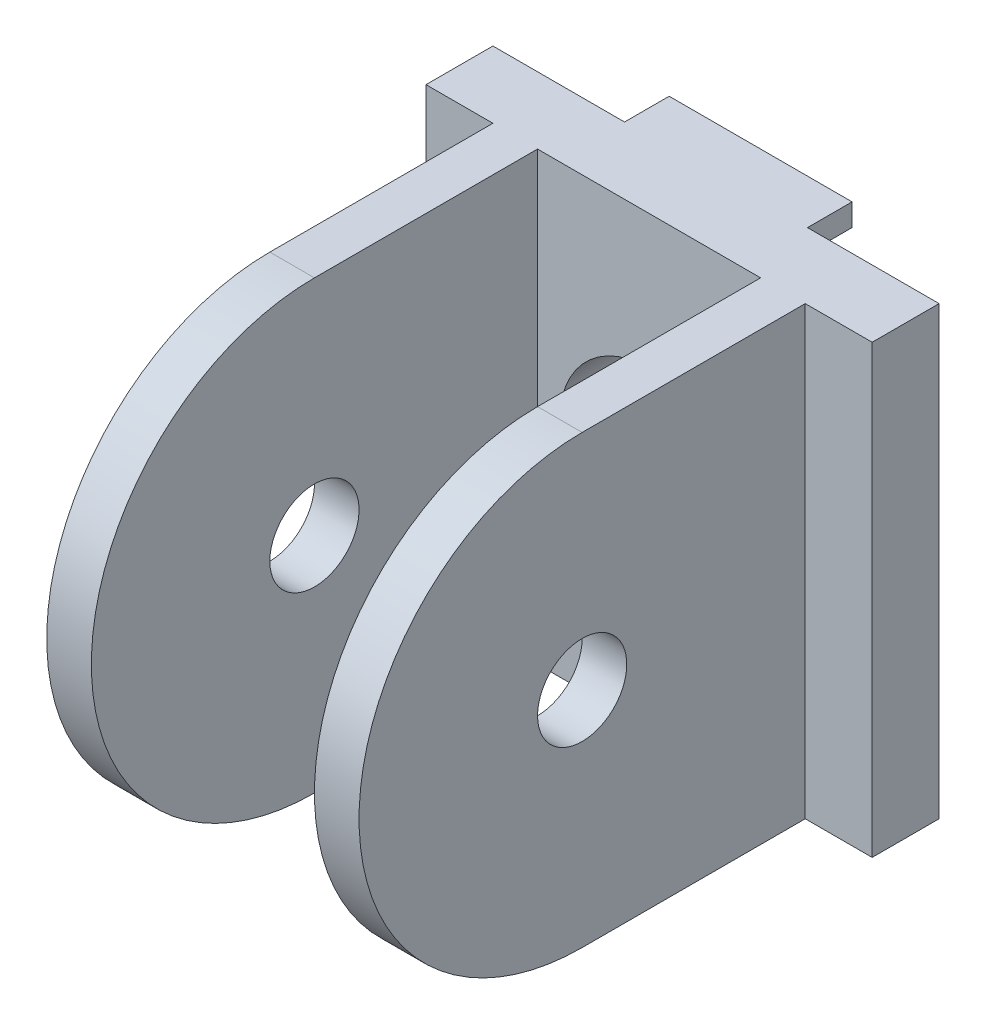
ISO-10303-21;
HEADER;
FILE_DESCRIPTION(('STEP AP214'),'2;1');
FILE_NAME('part.step','',(''),(''),'','','');
FILE_SCHEMA(('AUTOMOTIVE_DESIGN { 1 0 10303 214 1 1 1 1 }'));
ENDSEC;
DATA;
#1=APPLICATION_CONTEXT('core data for automotive mechanical design processes');
#2=APPLICATION_PROTOCOL_DEFINITION('international standard','automotive_design',2000,#1);
#3=PRODUCT_CONTEXT('',#1,'mechanical');
#4=PRODUCT('Part','Part','',(#3));
#5=PRODUCT_RELATED_PRODUCT_CATEGORY('part','',(#4));
#6=PRODUCT_DEFINITION_FORMATION('','',#4);
#7=PRODUCT_DEFINITION_CONTEXT('part definition',#1,'design');
#8=PRODUCT_DEFINITION('design','',#6,#7);
#9=PRODUCT_DEFINITION_SHAPE('','',#8);
#10=(LENGTH_UNIT() NAMED_UNIT(*) SI_UNIT(.MILLI.,.METRE.));
#11=(NAMED_UNIT(*) PLANE_ANGLE_UNIT() SI_UNIT($,.RADIAN.));
#12=(NAMED_UNIT(*) SI_UNIT($,.STERADIAN.) SOLID_ANGLE_UNIT());
#13=UNCERTAINTY_MEASURE_WITH_UNIT(LENGTH_MEASURE(1.E-05),#10,'distance_accuracy_value','');
#14=(GEOMETRIC_REPRESENTATION_CONTEXT(3) GLOBAL_UNCERTAINTY_ASSIGNED_CONTEXT((#13)) GLOBAL_UNIT_ASSIGNED_CONTEXT((#10,
#11,#12)) REPRESENTATION_CONTEXT('',''));
#15=CARTESIAN_POINT('',(0.,0.,0.));
#16=DIRECTION('',(0.,0.,1.));
#17=DIRECTION('',(1.,0.,0.));
#18=AXIS2_PLACEMENT_3D('',#15,#16,#17);
#19=CARTESIAN_POINT('',(10.,10.,0.));
#20=DIRECTION('',(0.,0.,-1.));
#21=DIRECTION('',(-1.,0.,0.));
#22=AXIS2_PLACEMENT_3D('',#19,#20,#21);
#23=PLANE('',#22);
#24=CARTESIAN_POINT('',(0.,0.,0.));
#25=DIRECTION('',(0.,0.,1.));
#26=DIRECTION('',(1.,0.,0.));
#27=AXIS2_PLACEMENT_3D('',#24,#25,#26);
#28=CIRCLE('',#27,4.);
#29=CARTESIAN_POINT('',(4.,0.,0.));
#30=VERTEX_POINT('',#29);
#31=EDGE_CURVE('E315',#30,#30,#28,.T.);
#32=ORIENTED_EDGE('',*,*,#31,.T.);
#33=EDGE_LOOP('',(#32));
#34=FACE_BOUND('',#33,.T.);
#35=DIRECTION('',(1.,0.,0.));
#36=VECTOR('',#35,1.);
#37=CARTESIAN_POINT('',(4.1,-9.,0.));
#38=LINE('',#37,#36);
#39=CARTESIAN_POINT('',(-4.1,-9.,0.));
#40=VERTEX_POINT('',#39);
#41=CARTESIAN_POINT('',(4.1,-9.,0.));
#42=VERTEX_POINT('',#41);
#43=EDGE_CURVE('E428',#40,#42,#38,.T.);
#44=ORIENTED_EDGE('',*,*,#43,.F.);
#45=DIRECTION('',(0.,1.,0.));
#46=VECTOR('',#45,1.);
#47=CARTESIAN_POINT('',(-4.1,-10.,0.));
#48=LINE('',#47,#46);
#49=CARTESIAN_POINT('',(-4.1,-10.,0.));
#50=VERTEX_POINT('',#49);
#51=EDGE_CURVE('E426',#50,#40,#48,.T.);
#52=ORIENTED_EDGE('',*,*,#51,.F.);
#53=DIRECTION('',(1.,0.,0.));
#54=VECTOR('',#53,1.);
#55=CARTESIAN_POINT('',(-10.,-10.,0.));
#56=LINE('',#55,#54);
#57=CARTESIAN_POINT('',(-10.,-10.,0.));
#58=VERTEX_POINT('',#57);
#59=EDGE_CURVE('E198',#58,#50,#56,.T.);
#60=ORIENTED_EDGE('',*,*,#59,.F.);
#61=DIRECTION('',(0.,-1.,0.));
#62=VECTOR('',#61,1.);
#63=CARTESIAN_POINT('',(-10.,-10.,0.));
#64=LINE('',#63,#62);
#65=CARTESIAN_POINT('',(-10.,10.,0.));
#66=VERTEX_POINT('',#65);
#67=EDGE_CURVE('E251',#66,#58,#64,.T.);
#68=ORIENTED_EDGE('',*,*,#67,.F.);
#69=DIRECTION('',(-1.,0.,0.));
#70=VECTOR('',#69,1.);
#71=CARTESIAN_POINT('',(-10.,10.,0.));
#72=LINE('',#71,#70);
#73=CARTESIAN_POINT('',(-4.1,10.,0.));
#74=VERTEX_POINT('',#73);
#75=EDGE_CURVE('E241',#74,#66,#72,.T.);
#76=ORIENTED_EDGE('',*,*,#75,.F.);
#77=DIRECTION('',(0.,1.,0.));
#78=VECTOR('',#77,1.);
#79=CARTESIAN_POINT('',(-4.1,10.,0.));
#80=LINE('',#79,#78);
#81=CARTESIAN_POINT('',(-4.1,9.,0.));
#82=VERTEX_POINT('',#81);
#83=EDGE_CURVE('E210',#82,#74,#80,.T.);
#84=ORIENTED_EDGE('',*,*,#83,.F.);
#85=DIRECTION('',(-1.,0.,0.));
#86=VECTOR('',#85,1.);
#87=CARTESIAN_POINT('',(4.1,9.,0.));
#88=LINE('',#87,#86);
#89=CARTESIAN_POINT('',(4.1,9.,0.));
#90=VERTEX_POINT('',#89);
#91=EDGE_CURVE('E58',#90,#82,#88,.T.);
#92=ORIENTED_EDGE('',*,*,#91,.F.);
#93=DIRECTION('',(0.,-1.,0.));
#94=VECTOR('',#93,1.);
#95=CARTESIAN_POINT('',(4.1,10.,0.));
#96=LINE('',#95,#94);
#97=CARTESIAN_POINT('',(4.1,10.,0.));
#98=VERTEX_POINT('',#97);
#99=EDGE_CURVE('E199',#98,#90,#96,.T.);
#100=ORIENTED_EDGE('',*,*,#99,.F.);
#101=CARTESIAN_POINT('',(10.,10.,0.));
#102=VERTEX_POINT('',#101);
#103=EDGE_CURVE('E244',#102,#98,#72,.T.);
#104=ORIENTED_EDGE('',*,*,#103,.F.);
#105=DIRECTION('',(0.,1.,0.));
#106=VECTOR('',#105,1.);
#107=CARTESIAN_POINT('',(10.,-10.,0.));
#108=LINE('',#107,#106);
#109=CARTESIAN_POINT('',(10.,-10.,0.));
#110=VERTEX_POINT('',#109);
#111=EDGE_CURVE('E245',#110,#102,#108,.T.);
#112=ORIENTED_EDGE('',*,*,#111,.F.);
#113=CARTESIAN_POINT('',(4.1,-10.,0.));
#114=VERTEX_POINT('',#113);
#115=EDGE_CURVE('E254',#114,#110,#56,.T.);
#116=ORIENTED_EDGE('',*,*,#115,.F.);
#117=DIRECTION('',(0.,-1.,0.));
#118=VECTOR('',#117,1.);
#119=CARTESIAN_POINT('',(4.1,-10.,0.));
#120=LINE('',#119,#118);
#121=EDGE_CURVE('E191',#42,#114,#120,.T.);
#122=ORIENTED_EDGE('',*,*,#121,.F.);
#123=EDGE_LOOP('',(#44,#52,#60,#68,#76,#84,#92,#100,#104,#112,#116,#122));
#124=FACE_BOUND('',#123,.T.);
#125=ADVANCED_FACE('F33',(#34,#124),#23,.T.);
#126=CARTESIAN_POINT('',(-10.,10.,3.));
#127=DIRECTION('',(0.,-1.,0.));
#128=DIRECTION('',(0.,0.,-1.));
#129=AXIS2_PLACEMENT_3D('',#126,#127,#128);
#130=PLANE('',#129);
#131=DIRECTION('',(1.,0.,0.));
#132=VECTOR('',#131,1.);
#133=CARTESIAN_POINT('',(-70.0694207708698,10.,13.));
#134=LINE('',#133,#132);
#135=CARTESIAN_POINT('',(5.,10.,13.));
#136=VERTEX_POINT('',#135);
#137=CARTESIAN_POINT('',(7.00000000000001,10.,13.));
#138=VERTEX_POINT('',#137);
#139=EDGE_CURVE('E327',#136,#138,#134,.T.);
#140=ORIENTED_EDGE('',*,*,#139,.T.);
#141=DIRECTION('',(0.,0.,-1.));
#142=VECTOR('',#141,1.);
#143=CARTESIAN_POINT('',(7.,10.,23.));
#144=LINE('',#143,#142);
#145=CARTESIAN_POINT('',(7.,10.,3.));
#146=VERTEX_POINT('',#145);
#147=EDGE_CURVE('E354',#138,#146,#144,.T.);
#148=ORIENTED_EDGE('',*,*,#147,.T.);
#149=DIRECTION('',(-1.,0.,0.));
#150=VECTOR('',#149,1.);
#151=CARTESIAN_POINT('',(-10.,10.,3.));
#152=LINE('',#151,#150);
#153=CARTESIAN_POINT('',(10.,10.,3.));
#154=VERTEX_POINT('',#153);
#155=EDGE_CURVE('E265',#154,#146,#152,.T.);
#156=ORIENTED_EDGE('',*,*,#155,.F.);
#157=DIRECTION('',(0.,0.,-1.));
#158=VECTOR('',#157,1.);
#159=CARTESIAN_POINT('',(10.,10.,3.));
#160=LINE('',#159,#158);
#161=EDGE_CURVE('E11',#154,#102,#160,.T.);
#162=ORIENTED_EDGE('',*,*,#161,.T.);
#163=ORIENTED_EDGE('',*,*,#103,.T.);
#164=DIRECTION('',(0.,0.,1.));
#165=VECTOR('',#164,1.);
#166=CARTESIAN_POINT('',(4.1,10.,-2.));
#167=LINE('',#166,#165);
#168=CARTESIAN_POINT('',(4.1,10.,-2.));
#169=VERTEX_POINT('',#168);
#170=EDGE_CURVE('E216',#169,#98,#167,.T.);
#171=ORIENTED_EDGE('',*,*,#170,.F.);
#172=DIRECTION('',(1.,0.,0.));
#173=VECTOR('',#172,1.);
#174=CARTESIAN_POINT('',(4.1,10.,-2.));
#175=LINE('',#174,#173);
#176=CARTESIAN_POINT('',(-4.1,10.,-2.));
#177=VERTEX_POINT('',#176);
#178=EDGE_CURVE('E214',#177,#169,#175,.T.);
#179=ORIENTED_EDGE('',*,*,#178,.F.);
#180=DIRECTION('',(0.,0.,1.));
#181=VECTOR('',#180,1.);
#182=CARTESIAN_POINT('',(-4.1,10.,-2.));
#183=LINE('',#182,#181);
#184=EDGE_CURVE('E227',#177,#74,#183,.T.);
#185=ORIENTED_EDGE('',*,*,#184,.T.);
#186=ORIENTED_EDGE('',*,*,#75,.T.);
#187=DIRECTION('',(0.,0.,-1.));
#188=VECTOR('',#187,1.);
#189=CARTESIAN_POINT('',(-10.,10.,3.));
#190=LINE('',#189,#188);
#191=CARTESIAN_POINT('',(-10.,10.,3.));
#192=VERTEX_POINT('',#191);
#193=EDGE_CURVE('E42',#192,#66,#190,.T.);
#194=ORIENTED_EDGE('',*,*,#193,.F.);
#195=CARTESIAN_POINT('',(-7.,10.,3.));
#196=VERTEX_POINT('',#195);
#197=EDGE_CURVE('E271',#196,#192,#152,.T.);
#198=ORIENTED_EDGE('',*,*,#197,.F.);
#199=DIRECTION('',(0.,0.,-1.));
#200=VECTOR('',#199,1.);
#201=CARTESIAN_POINT('',(-7.,10.,23.));
#202=LINE('',#201,#200);
#203=CARTESIAN_POINT('',(-7.00000000000001,10.,13.));
#204=VERTEX_POINT('',#203);
#205=EDGE_CURVE('E288',#204,#196,#202,.T.);
#206=ORIENTED_EDGE('',*,*,#205,.F.);
#207=CARTESIAN_POINT('',(-5.,10.,13.));
#208=VERTEX_POINT('',#207);
#209=EDGE_CURVE('E330',#204,#208,#134,.T.);
#210=ORIENTED_EDGE('',*,*,#209,.T.);
#211=DIRECTION('',(0.,0.,-1.));
#212=VECTOR('',#211,1.);
#213=CARTESIAN_POINT('',(-5.,10.,23.));
#214=LINE('',#213,#212);
#215=CARTESIAN_POINT('',(-5.,10.,3.));
#216=VERTEX_POINT('',#215);
#217=EDGE_CURVE('E302',#208,#216,#214,.T.);
#218=ORIENTED_EDGE('',*,*,#217,.T.);
#219=CARTESIAN_POINT('',(5.,10.,3.));
#220=VERTEX_POINT('',#219);
#221=EDGE_CURVE('E270',#220,#216,#152,.T.);
#222=ORIENTED_EDGE('',*,*,#221,.F.);
#223=DIRECTION('',(0.,0.,-1.));
#224=VECTOR('',#223,1.);
#225=CARTESIAN_POINT('',(5.,10.,23.));
#226=LINE('',#225,#224);
#227=EDGE_CURVE('E352',#136,#220,#226,.T.);
#228=ORIENTED_EDGE('',*,*,#227,.F.);
#229=EDGE_LOOP('',(#140,#148,#156,#162,#163,#171,#179,#185,#186,#194,#198,#206,#210,#218,#222,#228));
#230=FACE_BOUND('',#229,.T.);
#231=ADVANCED_FACE('F374',(#230),#130,.F.);
#232=CARTESIAN_POINT('',(10.,10.,3.));
#233=DIRECTION('',(0.,0.,-1.));
#234=DIRECTION('',(-1.,0.,0.));
#235=AXIS2_PLACEMENT_3D('',#232,#233,#234);
#236=PLANE('',#235);
#237=DIRECTION('',(0.,1.,0.));
#238=VECTOR('',#237,1.);
#239=CARTESIAN_POINT('',(7.,-10.,3.));
#240=LINE('',#239,#238);
#241=CARTESIAN_POINT('',(7.,-10.,3.));
#242=VERTEX_POINT('',#241);
#243=EDGE_CURVE('E341',#242,#146,#240,.T.);
#244=ORIENTED_EDGE('',*,*,#243,.F.);
#245=DIRECTION('',(1.,0.,0.));
#246=VECTOR('',#245,1.);
#247=CARTESIAN_POINT('',(-10.,-10.,3.));
#248=LINE('',#247,#246);
#249=CARTESIAN_POINT('',(10.,-10.,3.));
#250=VERTEX_POINT('',#249);
#251=EDGE_CURVE('E283',#242,#250,#248,.T.);
#252=ORIENTED_EDGE('',*,*,#251,.T.);
#253=DIRECTION('',(0.,1.,0.));
#254=VECTOR('',#253,1.);
#255=CARTESIAN_POINT('',(10.,-10.,3.));
#256=LINE('',#255,#254);
#257=EDGE_CURVE('E256',#250,#154,#256,.T.);
#258=ORIENTED_EDGE('',*,*,#257,.T.);
#259=ORIENTED_EDGE('',*,*,#155,.T.);
#260=EDGE_LOOP('',(#244,#252,#258,#259));
#261=FACE_BOUND('',#260,.T.);
#262=ADVANCED_FACE('F382',(#261),#236,.F.);
#263=CARTESIAN_POINT('',(0.,0.,3.));
#264=DIRECTION('',(0.,0.,1.));
#265=DIRECTION('',(1.,0.,0.));
#266=AXIS2_PLACEMENT_3D('',#263,#264,#265);
#267=CIRCLE('',#266,4.);
#268=CARTESIAN_POINT('',(4.,0.,3.));
#269=VERTEX_POINT('',#268);
#270=EDGE_CURVE('E320',#269,#269,#267,.T.);
#271=ORIENTED_EDGE('',*,*,#270,.F.);
#272=EDGE_LOOP('',(#271));
#273=FACE_BOUND('',#272,.T.);
#274=DIRECTION('',(0.,-1.,0.));
#275=VECTOR('',#274,1.);
#276=CARTESIAN_POINT('',(5.,-10.,3.));
#277=LINE('',#276,#275);
#278=CARTESIAN_POINT('',(5.,-10.,3.));
#279=VERTEX_POINT('',#278);
#280=EDGE_CURVE('E345',#220,#279,#277,.T.);
#281=ORIENTED_EDGE('',*,*,#280,.F.);
#282=ORIENTED_EDGE('',*,*,#221,.T.);
#283=DIRECTION('',(0.,1.,0.));
#284=VECTOR('',#283,1.);
#285=CARTESIAN_POINT('',(-5.,-10.,3.));
#286=LINE('',#285,#284);
#287=CARTESIAN_POINT('',(-5.,-10.,3.));
#288=VERTEX_POINT('',#287);
#289=EDGE_CURVE('E300',#288,#216,#286,.T.);
#290=ORIENTED_EDGE('',*,*,#289,.F.);
#291=EDGE_CURVE('E407',#288,#279,#248,.T.);
#292=ORIENTED_EDGE('',*,*,#291,.T.);
#293=EDGE_LOOP('',(#281,#282,#290,#292));
#294=FACE_BOUND('',#293,.T.);
#295=ADVANCED_FACE('F399',(#273,#294),#236,.F.);
#296=DIRECTION('',(0.,-1.,0.));
#297=VECTOR('',#296,1.);
#298=CARTESIAN_POINT('',(-7.,-10.,3.));
#299=LINE('',#298,#297);
#300=CARTESIAN_POINT('',(-7.,-10.,3.));
#301=VERTEX_POINT('',#300);
#302=EDGE_CURVE('E294',#196,#301,#299,.T.);
#303=ORIENTED_EDGE('',*,*,#302,.F.);
#304=ORIENTED_EDGE('',*,*,#197,.T.);
#305=DIRECTION('',(0.,-1.,0.));
#306=VECTOR('',#305,1.);
#307=CARTESIAN_POINT('',(-10.,-10.,3.));
#308=LINE('',#307,#306);
#309=CARTESIAN_POINT('',(-10.,-10.,3.));
#310=VERTEX_POINT('',#309);
#311=EDGE_CURVE('E269',#192,#310,#308,.T.);
#312=ORIENTED_EDGE('',*,*,#311,.T.);
#313=EDGE_CURVE('E261',#310,#301,#248,.T.);
#314=ORIENTED_EDGE('',*,*,#313,.T.);
#315=EDGE_LOOP('',(#303,#304,#312,#314));
#316=FACE_BOUND('',#315,.T.);
#317=ADVANCED_FACE('F371',(#316),#236,.F.);
#318=CARTESIAN_POINT('',(10.,-10.,3.));
#319=DIRECTION('',(-1.,0.,0.));
#320=DIRECTION('',(0.,0.,1.));
#321=AXIS2_PLACEMENT_3D('',#318,#319,#320);
#322=PLANE('',#321);
#323=ORIENTED_EDGE('',*,*,#111,.T.);
#324=ORIENTED_EDGE('',*,*,#161,.F.);
#325=ORIENTED_EDGE('',*,*,#257,.F.);
#326=DIRECTION('',(0.,0.,-1.));
#327=VECTOR('',#326,1.);
#328=CARTESIAN_POINT('',(10.,-10.,3.));
#329=LINE('',#328,#327);
#330=EDGE_CURVE('E257',#250,#110,#329,.T.);
#331=ORIENTED_EDGE('',*,*,#330,.T.);
#332=EDGE_LOOP('',(#323,#324,#325,#331));
#333=FACE_BOUND('',#332,.T.);
#334=ADVANCED_FACE('F35',(#333),#322,.F.);
#335=CARTESIAN_POINT('',(-10.,-10.,3.));
#336=DIRECTION('',(1.,0.,0.));
#337=DIRECTION('',(0.,0.,-1.));
#338=AXIS2_PLACEMENT_3D('',#335,#336,#337);
#339=PLANE('',#338);
#340=ORIENTED_EDGE('',*,*,#67,.T.);
#341=DIRECTION('',(0.,0.,-1.));
#342=VECTOR('',#341,1.);
#343=CARTESIAN_POINT('',(-10.,-10.,3.));
#344=LINE('',#343,#342);
#345=EDGE_CURVE('E260',#310,#58,#344,.T.);
#346=ORIENTED_EDGE('',*,*,#345,.F.);
#347=ORIENTED_EDGE('',*,*,#311,.F.);
#348=ORIENTED_EDGE('',*,*,#193,.T.);
#349=EDGE_LOOP('',(#340,#346,#347,#348));
#350=FACE_BOUND('',#349,.T.);
#351=ADVANCED_FACE('F424',(#350),#339,.F.);
#352=CARTESIAN_POINT('',(-10.,-10.,3.));
#353=DIRECTION('',(0.,1.,0.));
#354=DIRECTION('',(0.,0.,1.));
#355=AXIS2_PLACEMENT_3D('',#352,#353,#354);
#356=PLANE('',#355);
#357=DIRECTION('',(0.,0.,-1.));
#358=VECTOR('',#357,1.);
#359=CARTESIAN_POINT('',(7.,-10.,23.));
#360=LINE('',#359,#358);
#361=CARTESIAN_POINT('',(7.00000000000001,-10.,13.));
#362=VERTEX_POINT('',#361);
#363=EDGE_CURVE('E348',#362,#242,#360,.T.);
#364=ORIENTED_EDGE('',*,*,#363,.F.);
#365=DIRECTION('',(1.,0.,0.));
#366=VECTOR('',#365,1.);
#367=CARTESIAN_POINT('',(-70.0694207708698,-10.,13.));
#368=LINE('',#367,#366);
#369=CARTESIAN_POINT('',(5.,-10.,13.));
#370=VERTEX_POINT('',#369);
#371=EDGE_CURVE('E326',#370,#362,#368,.T.);
#372=ORIENTED_EDGE('',*,*,#371,.F.);
#373=DIRECTION('',(0.,0.,-1.));
#374=VECTOR('',#373,1.);
#375=CARTESIAN_POINT('',(5.,-10.,23.));
#376=LINE('',#375,#374);
#377=EDGE_CURVE('E350',#370,#279,#376,.T.);
#378=ORIENTED_EDGE('',*,*,#377,.T.);
#379=ORIENTED_EDGE('',*,*,#291,.F.);
#380=DIRECTION('',(0.,0.,-1.));
#381=VECTOR('',#380,1.);
#382=CARTESIAN_POINT('',(-5.,-10.,23.));
#383=LINE('',#382,#381);
#384=CARTESIAN_POINT('',(-5.,-10.,13.));
#385=VERTEX_POINT('',#384);
#386=EDGE_CURVE('E289',#385,#288,#383,.T.);
#387=ORIENTED_EDGE('',*,*,#386,.F.);
#388=CARTESIAN_POINT('',(-7.00000000000001,-10.,13.));
#389=VERTEX_POINT('',#388);
#390=EDGE_CURVE('E331',#389,#385,#368,.T.);
#391=ORIENTED_EDGE('',*,*,#390,.F.);
#392=DIRECTION('',(0.,0.,-1.));
#393=VECTOR('',#392,1.);
#394=CARTESIAN_POINT('',(-7.,-10.,23.));
#395=LINE('',#394,#393);
#396=EDGE_CURVE('E285',#389,#301,#395,.T.);
#397=ORIENTED_EDGE('',*,*,#396,.T.);
#398=ORIENTED_EDGE('',*,*,#313,.F.);
#399=ORIENTED_EDGE('',*,*,#345,.T.);
#400=ORIENTED_EDGE('',*,*,#59,.T.);
#401=DIRECTION('',(0.,0.,1.));
#402=VECTOR('',#401,1.);
#403=CARTESIAN_POINT('',(-4.1,-10.,-2.));
#404=LINE('',#403,#402);
#405=CARTESIAN_POINT('',(-4.1,-10.,-2.));
#406=VERTEX_POINT('',#405);
#407=EDGE_CURVE('E176',#406,#50,#404,.T.);
#408=ORIENTED_EDGE('',*,*,#407,.F.);
#409=DIRECTION('',(-1.,0.,0.));
#410=VECTOR('',#409,1.);
#411=CARTESIAN_POINT('',(4.1,-10.,-2.));
#412=LINE('',#411,#410);
#413=CARTESIAN_POINT('',(4.1,-10.,-2.));
#414=VERTEX_POINT('',#413);
#415=EDGE_CURVE('E183',#414,#406,#412,.T.);
#416=ORIENTED_EDGE('',*,*,#415,.F.);
#417=DIRECTION('',(0.,0.,1.));
#418=VECTOR('',#417,1.);
#419=CARTESIAN_POINT('',(4.1,-10.,-2.));
#420=LINE('',#419,#418);
#421=EDGE_CURVE('E435',#414,#114,#420,.T.);
#422=ORIENTED_EDGE('',*,*,#421,.T.);
#423=ORIENTED_EDGE('',*,*,#115,.T.);
#424=ORIENTED_EDGE('',*,*,#330,.F.);
#425=ORIENTED_EDGE('',*,*,#251,.F.);
#426=EDGE_LOOP('',(#364,#372,#378,#379,#387,#391,#397,#398,#399,#400,#408,#416,#422,#423,#424,#425));
#427=FACE_BOUND('',#426,.T.);
#428=ADVANCED_FACE('F195',(#427),#356,.F.);
#429=CARTESIAN_POINT('',(-5.,-10.,23.));
#430=DIRECTION('',(-1.,0.,0.));
#431=DIRECTION('',(0.,0.,1.));
#432=AXIS2_PLACEMENT_3D('',#429,#430,#431);
#433=PLANE('',#432);
#434=CARTESIAN_POINT('',(-5.,0.,13.));
#435=DIRECTION('',(-1.,0.,0.));
#436=DIRECTION('',(0.,0.,1.));
#437=AXIS2_PLACEMENT_3D('',#434,#435,#436);
#438=CIRCLE('',#437,2.);
#439=CARTESIAN_POINT('',(-5.,0.,15.));
#440=VERTEX_POINT('',#439);
#441=EDGE_CURVE('E312',#440,#440,#438,.T.);
#442=ORIENTED_EDGE('',*,*,#441,.T.);
#443=EDGE_LOOP('',(#442));
#444=FACE_BOUND('',#443,.T.);
#445=CARTESIAN_POINT('',(-5.,0.,13.));
#446=DIRECTION('',(-1.,0.,0.));
#447=DIRECTION('',(0.,0.,1.));
#448=AXIS2_PLACEMENT_3D('',#445,#446,#447);
#449=CIRCLE('',#448,10.);
#450=EDGE_CURVE('E336',#208,#385,#449,.F.);
#451=ORIENTED_EDGE('',*,*,#450,.T.);
#452=ORIENTED_EDGE('',*,*,#386,.T.);
#453=ORIENTED_EDGE('',*,*,#289,.T.);
#454=ORIENTED_EDGE('',*,*,#217,.F.);
#455=EDGE_LOOP('',(#451,#452,#453,#454));
#456=FACE_BOUND('',#455,.T.);
#457=ADVANCED_FACE('F412',(#444,#456),#433,.F.);
#458=CARTESIAN_POINT('',(-7.,-10.,23.));
#459=DIRECTION('',(1.,0.,0.));
#460=DIRECTION('',(0.,0.,-1.));
#461=AXIS2_PLACEMENT_3D('',#458,#459,#460);
#462=PLANE('',#461);
#463=CARTESIAN_POINT('',(-7.,0.,13.));
#464=DIRECTION('',(-1.,0.,0.));
#465=DIRECTION('',(0.,0.,1.));
#466=AXIS2_PLACEMENT_3D('',#463,#464,#465);
#467=CIRCLE('',#466,2.);
#468=CARTESIAN_POINT('',(-7.,0.,15.));
#469=VERTEX_POINT('',#468);
#470=EDGE_CURVE('E308',#469,#469,#467,.T.);
#471=ORIENTED_EDGE('',*,*,#470,.F.);
#472=EDGE_LOOP('',(#471));
#473=FACE_BOUND('',#472,.T.);
#474=ORIENTED_EDGE('',*,*,#396,.F.);
#475=CARTESIAN_POINT('',(-7.00000000000001,0.,13.));
#476=DIRECTION('',(1.,0.,0.));
#477=DIRECTION('',(0.,0.,-1.));
#478=AXIS2_PLACEMENT_3D('',#475,#476,#477);
#479=CIRCLE('',#478,10.);
#480=EDGE_CURVE('E339',#389,#204,#479,.F.);
#481=ORIENTED_EDGE('',*,*,#480,.T.);
#482=ORIENTED_EDGE('',*,*,#205,.T.);
#483=ORIENTED_EDGE('',*,*,#302,.T.);
#484=EDGE_LOOP('',(#474,#481,#482,#483));
#485=FACE_BOUND('',#484,.T.);
#486=ADVANCED_FACE('F366',(#473,#485),#462,.F.);
#487=CARTESIAN_POINT('',(7.,-10.,23.));
#488=DIRECTION('',(-1.,0.,0.));
#489=DIRECTION('',(0.,0.,1.));
#490=AXIS2_PLACEMENT_3D('',#487,#488,#489);
#491=PLANE('',#490);
#492=CARTESIAN_POINT('',(7.,0.,13.));
#493=DIRECTION('',(-1.,0.,0.));
#494=DIRECTION('',(0.,0.,1.));
#495=AXIS2_PLACEMENT_3D('',#492,#493,#494);
#496=CIRCLE('',#495,2.);
#497=CARTESIAN_POINT('',(7.,0.,15.));
#498=VERTEX_POINT('',#497);
#499=EDGE_CURVE('E307',#498,#498,#496,.T.);
#500=ORIENTED_EDGE('',*,*,#499,.T.);
#501=EDGE_LOOP('',(#500));
#502=FACE_BOUND('',#501,.T.);
#503=CARTESIAN_POINT('',(7.00000000000001,0.,13.));
#504=DIRECTION('',(-1.,0.,0.));
#505=DIRECTION('',(0.,0.,1.));
#506=AXIS2_PLACEMENT_3D('',#503,#504,#505);
#507=CIRCLE('',#506,10.);
#508=EDGE_CURVE('E337',#138,#362,#507,.F.);
#509=ORIENTED_EDGE('',*,*,#508,.T.);
#510=ORIENTED_EDGE('',*,*,#363,.T.);
#511=ORIENTED_EDGE('',*,*,#243,.T.);
#512=ORIENTED_EDGE('',*,*,#147,.F.);
#513=EDGE_LOOP('',(#509,#510,#511,#512));
#514=FACE_BOUND('',#513,.T.);
#515=ADVANCED_FACE('F440',(#502,#514),#491,.F.);
#516=CARTESIAN_POINT('',(5.,-10.,23.));
#517=DIRECTION('',(1.,0.,0.));
#518=DIRECTION('',(0.,0.,-1.));
#519=AXIS2_PLACEMENT_3D('',#516,#517,#518);
#520=PLANE('',#519);
#521=CARTESIAN_POINT('',(5.,0.,13.));
#522=DIRECTION('',(1.,0.,0.));
#523=DIRECTION('',(0.,0.,-1.));
#524=AXIS2_PLACEMENT_3D('',#521,#522,#523);
#525=CIRCLE('',#524,2.);
#526=CARTESIAN_POINT('',(5.,0.,11.));
#527=VERTEX_POINT('',#526);
#528=EDGE_CURVE('E304',#527,#527,#525,.T.);
#529=ORIENTED_EDGE('',*,*,#528,.T.);
#530=EDGE_LOOP('',(#529));
#531=FACE_BOUND('',#530,.T.);
#532=ORIENTED_EDGE('',*,*,#377,.F.);
#533=CARTESIAN_POINT('',(5.,0.,13.));
#534=DIRECTION('',(1.,0.,0.));
#535=DIRECTION('',(0.,0.,-1.));
#536=AXIS2_PLACEMENT_3D('',#533,#534,#535);
#537=CIRCLE('',#536,10.);
#538=EDGE_CURVE('E334',#370,#136,#537,.F.);
#539=ORIENTED_EDGE('',*,*,#538,.T.);
#540=ORIENTED_EDGE('',*,*,#227,.T.);
#541=ORIENTED_EDGE('',*,*,#280,.T.);
#542=EDGE_LOOP('',(#532,#539,#540,#541));
#543=FACE_BOUND('',#542,.T.);
#544=ADVANCED_FACE('F444',(#531,#543),#520,.F.);
#545=CARTESIAN_POINT('',(-70.0694207708698,0.,13.));
#546=DIRECTION('',(1.,0.,0.));
#547=DIRECTION('',(0.,0.,-1.));
#548=AXIS2_PLACEMENT_3D('',#545,#546,#547);
#549=CYLINDRICAL_SURFACE('',#548,10.);
#550=ORIENTED_EDGE('',*,*,#371,.T.);
#551=ORIENTED_EDGE('',*,*,#508,.F.);
#552=ORIENTED_EDGE('',*,*,#139,.F.);
#553=ORIENTED_EDGE('',*,*,#538,.F.);
#554=EDGE_LOOP('',(#550,#551,#552,#553));
#555=FACE_BOUND('',#554,.T.);
#556=ADVANCED_FACE('F443',(#555),#549,.T.);
#557=ORIENTED_EDGE('',*,*,#390,.T.);
#558=ORIENTED_EDGE('',*,*,#450,.F.);
#559=ORIENTED_EDGE('',*,*,#209,.F.);
#560=ORIENTED_EDGE('',*,*,#480,.F.);
#561=EDGE_LOOP('',(#557,#558,#559,#560));
#562=FACE_BOUND('',#561,.T.);
#563=ADVANCED_FACE('F417',(#562),#549,.T.);
#564=CARTESIAN_POINT('',(10.,0.,13.));
#565=DIRECTION('',(-1.,0.,0.));
#566=DIRECTION('',(0.,0.,1.));
#567=AXIS2_PLACEMENT_3D('',#564,#565,#566);
#568=CYLINDRICAL_SURFACE('',#567,2.);
#569=ORIENTED_EDGE('',*,*,#528,.F.);
#570=EDGE_LOOP('',(#569));
#571=FACE_BOUND('',#570,.T.);
#572=ORIENTED_EDGE('',*,*,#499,.F.);
#573=EDGE_LOOP('',(#572));
#574=FACE_BOUND('',#573,.T.);
#575=ADVANCED_FACE('F589',(#571,#574),#568,.F.);
#576=ORIENTED_EDGE('',*,*,#470,.T.);
#577=EDGE_LOOP('',(#576));
#578=FACE_BOUND('',#577,.T.);
#579=ORIENTED_EDGE('',*,*,#441,.F.);
#580=EDGE_LOOP('',(#579));
#581=FACE_BOUND('',#580,.T.);
#582=ADVANCED_FACE('F489',(#578,#581),#568,.F.);
#583=CARTESIAN_POINT('',(0.,0.,0.));
#584=DIRECTION('',(0.,0.,1.));
#585=DIRECTION('',(1.,0.,0.));
#586=AXIS2_PLACEMENT_3D('',#583,#584,#585);
#587=CYLINDRICAL_SURFACE('',#586,4.);
#588=ORIENTED_EDGE('',*,*,#31,.F.);
#589=EDGE_LOOP('',(#588));
#590=FACE_BOUND('',#589,.T.);
#591=ORIENTED_EDGE('',*,*,#270,.T.);
#592=EDGE_LOOP('',(#591));
#593=FACE_BOUND('',#592,.T.);
#594=ADVANCED_FACE('F397',(#590,#593),#587,.F.);
#595=CARTESIAN_POINT('',(4.1,10.,-2.));
#596=DIRECTION('',(-1.,0.,0.));
#597=DIRECTION('',(0.,0.,1.));
#598=AXIS2_PLACEMENT_3D('',#595,#596,#597);
#599=PLANE('',#598);
#600=ORIENTED_EDGE('',*,*,#99,.T.);
#601=DIRECTION('',(0.,0.,1.));
#602=VECTOR('',#601,1.);
#603=CARTESIAN_POINT('',(4.1,9.,-2.));
#604=LINE('',#603,#602);
#605=CARTESIAN_POINT('',(4.1,9.,-2.));
#606=VERTEX_POINT('',#605);
#607=EDGE_CURVE('E233',#606,#90,#604,.T.);
#608=ORIENTED_EDGE('',*,*,#607,.F.);
#609=DIRECTION('',(0.,-1.,0.));
#610=VECTOR('',#609,1.);
#611=CARTESIAN_POINT('',(4.1,10.,-2.));
#612=LINE('',#611,#610);
#613=EDGE_CURVE('E206',#169,#606,#612,.T.);
#614=ORIENTED_EDGE('',*,*,#613,.F.);
#615=ORIENTED_EDGE('',*,*,#170,.T.);
#616=EDGE_LOOP('',(#600,#608,#614,#615));
#617=FACE_BOUND('',#616,.T.);
#618=ADVANCED_FACE('F392',(#617),#599,.F.);
#619=CARTESIAN_POINT('',(4.1,9.,-2.));
#620=DIRECTION('',(0.,1.,0.));
#621=DIRECTION('',(0.,0.,1.));
#622=AXIS2_PLACEMENT_3D('',#619,#620,#621);
#623=PLANE('',#622);
#624=ORIENTED_EDGE('',*,*,#91,.T.);
#625=DIRECTION('',(0.,0.,1.));
#626=VECTOR('',#625,1.);
#627=CARTESIAN_POINT('',(-4.1,9.,-2.));
#628=LINE('',#627,#626);
#629=CARTESIAN_POINT('',(-4.1,9.,-2.));
#630=VERTEX_POINT('',#629);
#631=EDGE_CURVE('E220',#630,#82,#628,.T.);
#632=ORIENTED_EDGE('',*,*,#631,.F.);
#633=DIRECTION('',(-1.,0.,0.));
#634=VECTOR('',#633,1.);
#635=CARTESIAN_POINT('',(4.1,9.,-2.));
#636=LINE('',#635,#634);
#637=EDGE_CURVE('E209',#606,#630,#636,.T.);
#638=ORIENTED_EDGE('',*,*,#637,.F.);
#639=ORIENTED_EDGE('',*,*,#607,.T.);
#640=EDGE_LOOP('',(#624,#632,#638,#639));
#641=FACE_BOUND('',#640,.T.);
#642=ADVANCED_FACE('F524',(#641),#623,.F.);
#643=CARTESIAN_POINT('',(-4.1,10.,-2.));
#644=DIRECTION('',(1.,0.,0.));
#645=DIRECTION('',(0.,0.,-1.));
#646=AXIS2_PLACEMENT_3D('',#643,#644,#645);
#647=PLANE('',#646);
#648=ORIENTED_EDGE('',*,*,#83,.T.);
#649=ORIENTED_EDGE('',*,*,#184,.F.);
#650=DIRECTION('',(0.,1.,0.));
#651=VECTOR('',#650,1.);
#652=CARTESIAN_POINT('',(-4.1,10.,-2.));
#653=LINE('',#652,#651);
#654=EDGE_CURVE('E212',#630,#177,#653,.T.);
#655=ORIENTED_EDGE('',*,*,#654,.F.);
#656=ORIENTED_EDGE('',*,*,#631,.T.);
#657=EDGE_LOOP('',(#648,#649,#655,#656));
#658=FACE_BOUND('',#657,.T.);
#659=ADVANCED_FACE('F533',(#658),#647,.F.);
#660=CARTESIAN_POINT('',(4.1,9.,-2.));
#661=DIRECTION('',(0.,0.,-1.));
#662=DIRECTION('',(-1.,0.,0.));
#663=AXIS2_PLACEMENT_3D('',#660,#661,#662);
#664=PLANE('',#663);
#665=ORIENTED_EDGE('',*,*,#613,.T.);
#666=ORIENTED_EDGE('',*,*,#637,.T.);
#667=ORIENTED_EDGE('',*,*,#654,.T.);
#668=ORIENTED_EDGE('',*,*,#178,.T.);
#669=EDGE_LOOP('',(#665,#666,#667,#668));
#670=FACE_BOUND('',#669,.T.);
#671=ADVANCED_FACE('F542',(#670),#664,.T.);
#672=CARTESIAN_POINT('',(-4.1,-10.,-2.));
#673=DIRECTION('',(1.,0.,0.));
#674=DIRECTION('',(0.,0.,-1.));
#675=AXIS2_PLACEMENT_3D('',#672,#673,#674);
#676=PLANE('',#675);
#677=ORIENTED_EDGE('',*,*,#51,.T.);
#678=DIRECTION('',(0.,0.,1.));
#679=VECTOR('',#678,1.);
#680=CARTESIAN_POINT('',(-4.1,-9.,-2.));
#681=LINE('',#680,#679);
#682=CARTESIAN_POINT('',(-4.1,-9.,-2.));
#683=VERTEX_POINT('',#682);
#684=EDGE_CURVE('E179',#683,#40,#681,.T.);
#685=ORIENTED_EDGE('',*,*,#684,.F.);
#686=DIRECTION('',(0.,1.,0.));
#687=VECTOR('',#686,1.);
#688=CARTESIAN_POINT('',(-4.1,-10.,-2.));
#689=LINE('',#688,#687);
#690=EDGE_CURVE('E172',#406,#683,#689,.T.);
#691=ORIENTED_EDGE('',*,*,#690,.F.);
#692=ORIENTED_EDGE('',*,*,#407,.T.);
#693=EDGE_LOOP('',(#677,#685,#691,#692));
#694=FACE_BOUND('',#693,.T.);
#695=ADVANCED_FACE('F174',(#694),#676,.F.);
#696=CARTESIAN_POINT('',(4.1,-9.,-2.));
#697=DIRECTION('',(0.,-1.,0.));
#698=DIRECTION('',(0.,0.,-1.));
#699=AXIS2_PLACEMENT_3D('',#696,#697,#698);
#700=PLANE('',#699);
#701=ORIENTED_EDGE('',*,*,#43,.T.);
#702=DIRECTION('',(0.,0.,1.));
#703=VECTOR('',#702,1.);
#704=CARTESIAN_POINT('',(4.1,-9.,-2.));
#705=LINE('',#704,#703);
#706=CARTESIAN_POINT('',(4.1,-9.,-2.));
#707=VERTEX_POINT('',#706);
#708=EDGE_CURVE('E50',#707,#42,#705,.T.);
#709=ORIENTED_EDGE('',*,*,#708,.F.);
#710=DIRECTION('',(1.,0.,0.));
#711=VECTOR('',#710,1.);
#712=CARTESIAN_POINT('',(4.1,-9.,-2.));
#713=LINE('',#712,#711);
#714=EDGE_CURVE('E182',#683,#707,#713,.T.);
#715=ORIENTED_EDGE('',*,*,#714,.F.);
#716=ORIENTED_EDGE('',*,*,#684,.T.);
#717=EDGE_LOOP('',(#701,#709,#715,#716));
#718=FACE_BOUND('',#717,.T.);
#719=ADVANCED_FACE('F437',(#718),#700,.F.);
#720=CARTESIAN_POINT('',(4.1,-10.,-2.));
#721=DIRECTION('',(-1.,0.,0.));
#722=DIRECTION('',(0.,0.,1.));
#723=AXIS2_PLACEMENT_3D('',#720,#721,#722);
#724=PLANE('',#723);
#725=ORIENTED_EDGE('',*,*,#121,.T.);
#726=ORIENTED_EDGE('',*,*,#421,.F.);
#727=DIRECTION('',(0.,-1.,0.));
#728=VECTOR('',#727,1.);
#729=CARTESIAN_POINT('',(4.1,-10.,-2.));
#730=LINE('',#729,#728);
#731=EDGE_CURVE('E187',#707,#414,#730,.T.);
#732=ORIENTED_EDGE('',*,*,#731,.F.);
#733=ORIENTED_EDGE('',*,*,#708,.T.);
#734=EDGE_LOOP('',(#725,#726,#732,#733));
#735=FACE_BOUND('',#734,.T.);
#736=ADVANCED_FACE('F438',(#735),#724,.F.);
#737=CARTESIAN_POINT('',(-4.1,-10.,-2.));
#738=DIRECTION('',(0.,0.,-1.));
#739=DIRECTION('',(-1.,0.,0.));
#740=AXIS2_PLACEMENT_3D('',#737,#738,#739);
#741=PLANE('',#740);
#742=ORIENTED_EDGE('',*,*,#415,.T.);
#743=ORIENTED_EDGE('',*,*,#690,.T.);
#744=ORIENTED_EDGE('',*,*,#714,.T.);
#745=ORIENTED_EDGE('',*,*,#731,.T.);
#746=EDGE_LOOP('',(#742,#743,#744,#745));
#747=FACE_BOUND('',#746,.T.);
#748=ADVANCED_FACE('F186',(#747),#741,.T.);
#749=CLOSED_SHELL('',(#125,#231,#262,#295,#317,#334,#351,#428,#457,#486,#515,#544,#556,#563,
#575,#582,#594,#618,#642,#659,#671,#695,#719,#736,#748));
#750=MANIFOLD_SOLID_BREP('B2',#749);
#751=ADVANCED_BREP_SHAPE_REPRESENTATION('',(#18,#750),#14);
#752=SHAPE_DEFINITION_REPRESENTATION(#9,#751);
ENDSEC;
END-ISO-10303-21;
